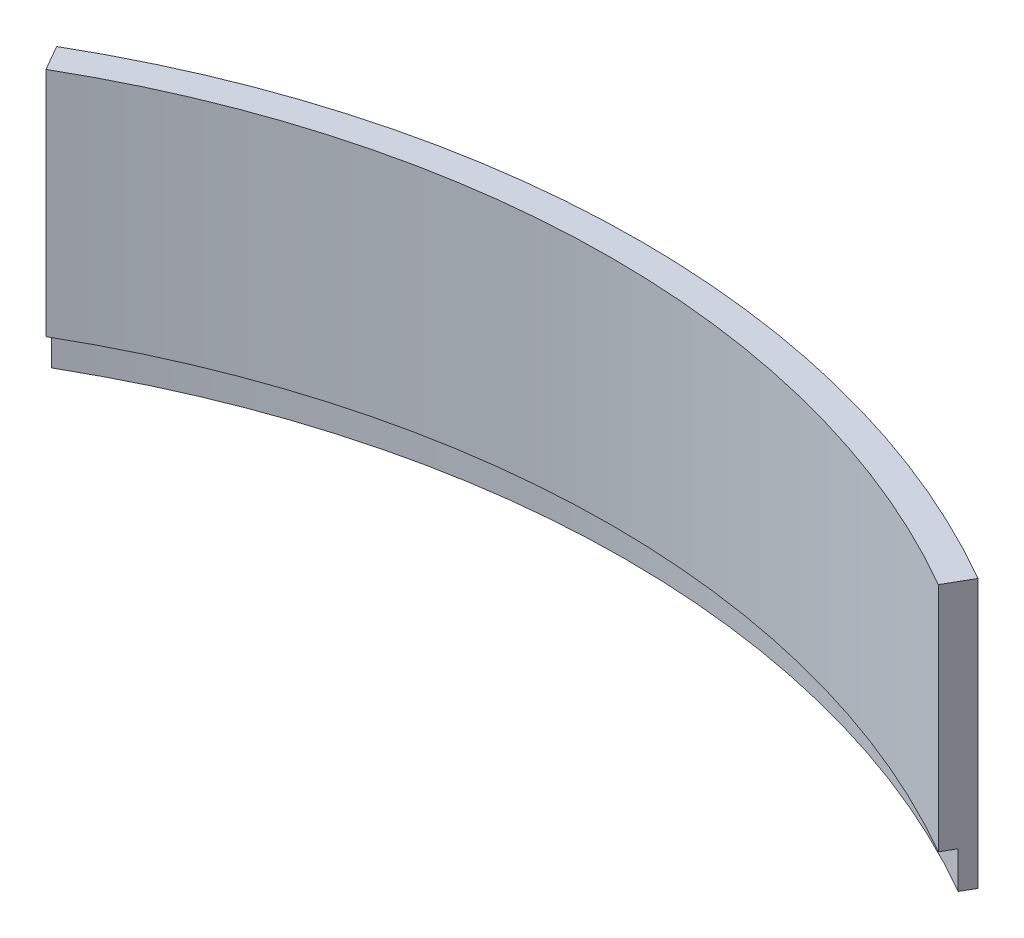
ISO-10303-21;
HEADER;
FILE_DESCRIPTION(('STEP AP214'),'2;1');
FILE_NAME('part.step','',(''),(''),'','','');
FILE_SCHEMA(('AUTOMOTIVE_DESIGN { 1 0 10303 214 1 1 1 1 }'));
ENDSEC;
DATA;
#1=APPLICATION_CONTEXT('core data for automotive mechanical design processes');
#2=APPLICATION_PROTOCOL_DEFINITION('international standard','automotive_design',2000,#1);
#3=PRODUCT_CONTEXT('',#1,'mechanical');
#4=PRODUCT('Part','Part','',(#3));
#5=PRODUCT_RELATED_PRODUCT_CATEGORY('part','',(#4));
#6=PRODUCT_DEFINITION_FORMATION('','',#4);
#7=PRODUCT_DEFINITION_CONTEXT('part definition',#1,'design');
#8=PRODUCT_DEFINITION('design','',#6,#7);
#9=PRODUCT_DEFINITION_SHAPE('','',#8);
#10=(LENGTH_UNIT() NAMED_UNIT(*) SI_UNIT(.MILLI.,.METRE.));
#11=(NAMED_UNIT(*) PLANE_ANGLE_UNIT() SI_UNIT($,.RADIAN.));
#12=(NAMED_UNIT(*) SI_UNIT($,.STERADIAN.) SOLID_ANGLE_UNIT());
#13=UNCERTAINTY_MEASURE_WITH_UNIT(LENGTH_MEASURE(1.E-05),#10,'distance_accuracy_value','');
#14=(GEOMETRIC_REPRESENTATION_CONTEXT(3) GLOBAL_UNCERTAINTY_ASSIGNED_CONTEXT((#13)) GLOBAL_UNIT_ASSIGNED_CONTEXT((#10,
#11,#12)) REPRESENTATION_CONTEXT('',''));
#15=CARTESIAN_POINT('',(0.,0.,0.));
#16=DIRECTION('',(0.,0.,1.));
#17=DIRECTION('',(1.,0.,0.));
#18=AXIS2_PLACEMENT_3D('',#15,#16,#17);
#19=CARTESIAN_POINT('',(0.,34.5,3.33066907387547E-13));
#20=DIRECTION('',(0.,-1.,0.));
#21=DIRECTION('',(0.,0.,-1.));
#22=AXIS2_PLACEMENT_3D('',#19,#20,#21);
#23=CYLINDRICAL_SURFACE('',#22,127.);
#24=DIRECTION('',(0.,-1.,0.));
#25=VECTOR('',#24,1.);
#26=CARTESIAN_POINT('',(63.4999999999999,34.5,-109.985226280624));
#27=LINE('',#26,#25);
#28=CARTESIAN_POINT('',(63.4999999999999,34.5,-109.985226280624));
#29=VERTEX_POINT('',#28);
#30=CARTESIAN_POINT('',(63.4999999999999,-2.5,-109.985226280624));
#31=VERTEX_POINT('',#30);
#32=EDGE_CURVE('E112',#29,#31,#27,.T.);
#33=ORIENTED_EDGE('',*,*,#32,.T.);
#34=CARTESIAN_POINT('',(0.,-2.5,3.33066907387547E-13));
#35=DIRECTION('',(0.,1.,0.));
#36=DIRECTION('',(0.,0.,1.));
#37=AXIS2_PLACEMENT_3D('',#34,#35,#36);
#38=CIRCLE('',#37,127.);
#39=CARTESIAN_POINT('',(-63.4999999999999,-2.5,-109.985226280624));
#40=VERTEX_POINT('',#39);
#41=EDGE_CURVE('E98',#40,#31,#38,.F.);
#42=ORIENTED_EDGE('',*,*,#41,.F.);
#43=DIRECTION('',(0.,-1.,0.));
#44=VECTOR('',#43,1.);
#45=CARTESIAN_POINT('',(-63.4999999999999,34.5,-109.985226280624));
#46=LINE('',#45,#44);
#47=CARTESIAN_POINT('',(-63.4999999999999,34.5,-109.985226280624));
#48=VERTEX_POINT('',#47);
#49=EDGE_CURVE('E11',#48,#40,#46,.T.);
#50=ORIENTED_EDGE('',*,*,#49,.F.);
#51=CARTESIAN_POINT('',(0.,34.5,3.33066907387547E-13));
#52=DIRECTION('',(0.,1.,0.));
#53=DIRECTION('',(0.,0.,1.));
#54=AXIS2_PLACEMENT_3D('',#51,#52,#53);
#55=CIRCLE('',#54,127.);
#56=EDGE_CURVE('E119',#48,#29,#55,.F.);
#57=ORIENTED_EDGE('',*,*,#56,.T.);
#58=EDGE_LOOP('',(#33,#42,#50,#57));
#59=FACE_BOUND('',#58,.T.);
#60=ADVANCED_FACE('F34',(#59),#23,.T.);
#61=CARTESIAN_POINT('',(0.,34.5,0.));
#62=DIRECTION('',(0.866025403784439,0.,-0.499999999999999));
#63=DIRECTION('',(-0.499999999999999,0.,-0.866025403784439));
#64=AXIS2_PLACEMENT_3D('',#61,#62,#63);
#65=PLANE('',#64);
#66=ORIENTED_EDGE('',*,*,#49,.T.);
#67=DIRECTION('',(0.499999999999999,0.,0.86602540378444));
#68=VECTOR('',#67,1.);
#69=CARTESIAN_POINT('',(0.,-2.5,0.));
#70=LINE('',#69,#68);
#71=CARTESIAN_POINT('',(-62.4999999999998,-2.5,-108.253175473055));
#72=VERTEX_POINT('',#71);
#73=EDGE_CURVE('E111',#40,#72,#70,.T.);
#74=ORIENTED_EDGE('',*,*,#73,.T.);
#75=DIRECTION('',(0.,-1.,0.));
#76=VECTOR('',#75,1.);
#77=CARTESIAN_POINT('',(-62.4999999999998,34.5,-108.253175473055));
#78=LINE('',#77,#76);
#79=CARTESIAN_POINT('',(-62.4999999999998,2.6,-108.253175473055));
#80=VERTEX_POINT('',#79);
#81=EDGE_CURVE('E41',#80,#72,#78,.T.);
#82=ORIENTED_EDGE('',*,*,#81,.F.);
#83=DIRECTION('',(0.499999999999999,0.,0.86602540378444));
#84=VECTOR('',#83,1.);
#85=CARTESIAN_POINT('',(0.,2.6,0.));
#86=LINE('',#85,#84);
#87=CARTESIAN_POINT('',(-61.4999999999998,2.6,-106.521124665486));
#88=VERTEX_POINT('',#87);
#89=EDGE_CURVE('E87',#80,#88,#86,.T.);
#90=ORIENTED_EDGE('',*,*,#89,.T.);
#91=DIRECTION('',(0.,-1.,0.));
#92=VECTOR('',#91,1.);
#93=CARTESIAN_POINT('',(-61.4999999999998,160.858493318132,-106.521124665486));
#94=LINE('',#93,#92);
#95=CARTESIAN_POINT('',(-61.4999999999998,34.5,-106.521124665486));
#96=VERTEX_POINT('',#95);
#97=EDGE_CURVE('E131',#96,#88,#94,.T.);
#98=ORIENTED_EDGE('',*,*,#97,.F.);
#99=DIRECTION('',(0.499999999999999,0.,0.86602540378444));
#100=VECTOR('',#99,1.);
#101=CARTESIAN_POINT('',(0.,34.5,0.));
#102=LINE('',#101,#100);
#103=EDGE_CURVE('E117',#48,#96,#102,.T.);
#104=ORIENTED_EDGE('',*,*,#103,.F.);
#105=EDGE_LOOP('',(#66,#74,#82,#90,#98,#104));
#106=FACE_BOUND('',#105,.T.);
#107=ADVANCED_FACE('F109',(#106),#65,.F.);
#108=CARTESIAN_POINT('',(0.,34.5,0.));
#109=DIRECTION('',(-0.866025403784439,0.,-0.499999999999999));
#110=DIRECTION('',(-0.499999999999999,0.,0.866025403784439));
#111=AXIS2_PLACEMENT_3D('',#108,#109,#110);
#112=PLANE('',#111);
#113=DIRECTION('',(0.499999999999999,0.,-0.86602540378444));
#114=VECTOR('',#113,1.);
#115=CARTESIAN_POINT('',(0.,34.5,0.));
#116=LINE('',#115,#114);
#117=CARTESIAN_POINT('',(61.4999999999998,34.5,-106.521124665486));
#118=VERTEX_POINT('',#117);
#119=EDGE_CURVE('E48',#118,#29,#116,.T.);
#120=ORIENTED_EDGE('',*,*,#119,.F.);
#121=DIRECTION('',(0.,-1.,0.));
#122=VECTOR('',#121,1.);
#123=CARTESIAN_POINT('',(61.4999999999998,160.858493318132,-106.521124665486));
#124=LINE('',#123,#122);
#125=CARTESIAN_POINT('',(61.4999999999998,2.6,-106.521124665486));
#126=VERTEX_POINT('',#125);
#127=EDGE_CURVE('E105',#118,#126,#124,.T.);
#128=ORIENTED_EDGE('',*,*,#127,.T.);
#129=DIRECTION('',(0.499999999999999,0.,-0.86602540378444));
#130=VECTOR('',#129,1.);
#131=CARTESIAN_POINT('',(0.,2.6,0.));
#132=LINE('',#131,#130);
#133=CARTESIAN_POINT('',(62.4999999999999,2.6,-108.253175473055));
#134=VERTEX_POINT('',#133);
#135=EDGE_CURVE('E130',#126,#134,#132,.T.);
#136=ORIENTED_EDGE('',*,*,#135,.T.);
#137=DIRECTION('',(0.,-1.,0.));
#138=VECTOR('',#137,1.);
#139=CARTESIAN_POINT('',(62.4999999999999,34.5,-108.253175473055));
#140=LINE('',#139,#138);
#141=CARTESIAN_POINT('',(62.4999999999999,-2.5,-108.253175473055));
#142=VERTEX_POINT('',#141);
#143=EDGE_CURVE('E104',#134,#142,#140,.T.);
#144=ORIENTED_EDGE('',*,*,#143,.T.);
#145=DIRECTION('',(0.499999999999999,0.,-0.86602540378444));
#146=VECTOR('',#145,1.);
#147=CARTESIAN_POINT('',(0.,-2.5,0.));
#148=LINE('',#147,#146);
#149=EDGE_CURVE('E121',#142,#31,#148,.T.);
#150=ORIENTED_EDGE('',*,*,#149,.T.);
#151=ORIENTED_EDGE('',*,*,#32,.F.);
#152=EDGE_LOOP('',(#120,#128,#136,#144,#150,#151));
#153=FACE_BOUND('',#152,.T.);
#154=ADVANCED_FACE('F136',(#153),#112,.F.);
#155=CARTESIAN_POINT('',(0.,34.5,0.));
#156=DIRECTION('',(0.,1.,0.));
#157=DIRECTION('',(0.,0.,1.));
#158=AXIS2_PLACEMENT_3D('',#155,#156,#157);
#159=PLANE('',#158);
#160=ORIENTED_EDGE('',*,*,#56,.F.);
#161=ORIENTED_EDGE('',*,*,#103,.T.);
#162=CARTESIAN_POINT('',(0.,34.5,3.33066907387547E-13));
#163=DIRECTION('',(0.,1.,0.));
#164=DIRECTION('',(0.,0.,1.));
#165=AXIS2_PLACEMENT_3D('',#162,#163,#164);
#166=CIRCLE('',#165,123.);
#167=EDGE_CURVE('E106',#96,#118,#166,.F.);
#168=ORIENTED_EDGE('',*,*,#167,.T.);
#169=ORIENTED_EDGE('',*,*,#119,.T.);
#170=EDGE_LOOP('',(#160,#161,#168,#169));
#171=FACE_BOUND('',#170,.T.);
#172=ADVANCED_FACE('F141',(#171),#159,.T.);
#173=CARTESIAN_POINT('',(0.,-2.5,0.));
#174=DIRECTION('',(0.,1.,0.));
#175=DIRECTION('',(0.,0.,1.));
#176=AXIS2_PLACEMENT_3D('',#173,#174,#175);
#177=PLANE('',#176);
#178=ORIENTED_EDGE('',*,*,#41,.T.);
#179=ORIENTED_EDGE('',*,*,#149,.F.);
#180=CARTESIAN_POINT('',(0.,-2.5,3.33066907387547E-13));
#181=DIRECTION('',(0.,1.,0.));
#182=DIRECTION('',(0.,0.,1.));
#183=AXIS2_PLACEMENT_3D('',#180,#181,#182);
#184=CIRCLE('',#183,125.);
#185=EDGE_CURVE('E124',#72,#142,#184,.F.);
#186=ORIENTED_EDGE('',*,*,#185,.F.);
#187=ORIENTED_EDGE('',*,*,#73,.F.);
#188=EDGE_LOOP('',(#178,#179,#186,#187));
#189=FACE_BOUND('',#188,.T.);
#190=ADVANCED_FACE('F144',(#189),#177,.F.);
#191=CARTESIAN_POINT('',(0.,2.6,0.));
#192=DIRECTION('',(0.,1.,0.));
#193=DIRECTION('',(0.,0.,1.));
#194=AXIS2_PLACEMENT_3D('',#191,#192,#193);
#195=PLANE('',#194);
#196=ORIENTED_EDGE('',*,*,#89,.F.);
#197=CARTESIAN_POINT('',(0.,2.6,3.33066907387547E-13));
#198=DIRECTION('',(0.,1.,0.));
#199=DIRECTION('',(0.,0.,1.));
#200=AXIS2_PLACEMENT_3D('',#197,#198,#199);
#201=CIRCLE('',#200,125.);
#202=EDGE_CURVE('E91',#80,#134,#201,.F.);
#203=ORIENTED_EDGE('',*,*,#202,.T.);
#204=ORIENTED_EDGE('',*,*,#135,.F.);
#205=CARTESIAN_POINT('',(0.,2.6,3.33066907387547E-13));
#206=DIRECTION('',(0.,1.,0.));
#207=DIRECTION('',(0.,0.,1.));
#208=AXIS2_PLACEMENT_3D('',#205,#206,#207);
#209=CIRCLE('',#208,123.);
#210=EDGE_CURVE('E94',#88,#126,#209,.F.);
#211=ORIENTED_EDGE('',*,*,#210,.F.);
#212=EDGE_LOOP('',(#196,#203,#204,#211));
#213=FACE_BOUND('',#212,.T.);
#214=ADVANCED_FACE('F89',(#213),#195,.F.);
#215=CARTESIAN_POINT('',(0.,160.858493318132,3.33066907387547E-13));
#216=DIRECTION('',(0.,-1.,0.));
#217=DIRECTION('',(0.,0.,-1.));
#218=AXIS2_PLACEMENT_3D('',#215,#216,#217);
#219=CYLINDRICAL_SURFACE('',#218,123.);
#220=ORIENTED_EDGE('',*,*,#167,.F.);
#221=ORIENTED_EDGE('',*,*,#97,.T.);
#222=ORIENTED_EDGE('',*,*,#210,.T.);
#223=ORIENTED_EDGE('',*,*,#127,.F.);
#224=EDGE_LOOP('',(#220,#221,#222,#223));
#225=FACE_BOUND('',#224,.T.);
#226=ADVANCED_FACE('F140',(#225),#219,.F.);
#227=CARTESIAN_POINT('',(0.,34.5,3.33066907387547E-13));
#228=DIRECTION('',(0.,-1.,0.));
#229=DIRECTION('',(0.,0.,-1.));
#230=AXIS2_PLACEMENT_3D('',#227,#228,#229);
#231=CYLINDRICAL_SURFACE('',#230,125.);
#232=ORIENTED_EDGE('',*,*,#185,.T.);
#233=ORIENTED_EDGE('',*,*,#143,.F.);
#234=ORIENTED_EDGE('',*,*,#202,.F.);
#235=ORIENTED_EDGE('',*,*,#81,.T.);
#236=EDGE_LOOP('',(#232,#233,#234,#235));
#237=FACE_BOUND('',#236,.T.);
#238=ADVANCED_FACE('F102',(#237),#231,.F.);
#239=CLOSED_SHELL('',(#60,#107,#154,#172,#190,#214,#226,#238));
#240=MANIFOLD_SOLID_BREP('B2',#239);
#241=ADVANCED_BREP_SHAPE_REPRESENTATION('',(#18,#240),#14);
#242=SHAPE_DEFINITION_REPRESENTATION(#9,#241);
ENDSEC;
END-ISO-10303-21;
